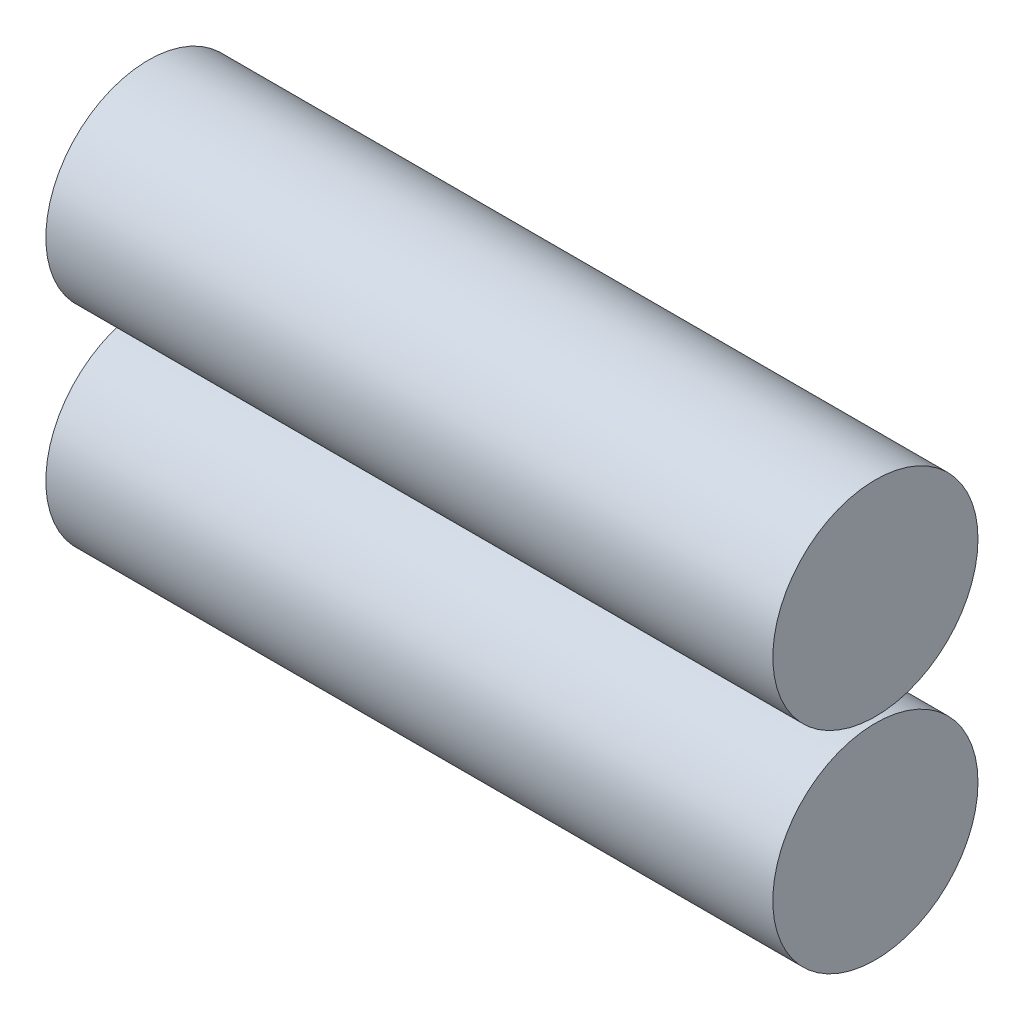
ISO-10303-21;
HEADER;
FILE_DESCRIPTION(('STEP AP214'),'2;1');
FILE_NAME('part.step','',(''),(''),'','','');
FILE_SCHEMA(('AUTOMOTIVE_DESIGN { 1 0 10303 214 1 1 1 1 }'));
ENDSEC;
DATA;
#1=APPLICATION_CONTEXT('core data for automotive mechanical design processes');
#2=APPLICATION_PROTOCOL_DEFINITION('international standard','automotive_design',2000,#1);
#3=PRODUCT_CONTEXT('',#1,'mechanical');
#4=PRODUCT('Part','Part','',(#3));
#5=PRODUCT_RELATED_PRODUCT_CATEGORY('part','',(#4));
#6=PRODUCT_DEFINITION_FORMATION('','',#4);
#7=PRODUCT_DEFINITION_CONTEXT('part definition',#1,'design');
#8=PRODUCT_DEFINITION('design','',#6,#7);
#9=PRODUCT_DEFINITION_SHAPE('','',#8);
#10=(LENGTH_UNIT() NAMED_UNIT(*) SI_UNIT(.MILLI.,.METRE.));
#11=(NAMED_UNIT(*) PLANE_ANGLE_UNIT() SI_UNIT($,.RADIAN.));
#12=(NAMED_UNIT(*) SI_UNIT($,.STERADIAN.) SOLID_ANGLE_UNIT());
#13=UNCERTAINTY_MEASURE_WITH_UNIT(LENGTH_MEASURE(1.E-05),#10,'distance_accuracy_value','');
#14=(GEOMETRIC_REPRESENTATION_CONTEXT(3) GLOBAL_UNCERTAINTY_ASSIGNED_CONTEXT((#13)) GLOBAL_UNIT_ASSIGNED_CONTEXT((#10,
#11,#12)) REPRESENTATION_CONTEXT('',''));
#15=CARTESIAN_POINT('',(0.,0.,0.));
#16=DIRECTION('',(0.,0.,1.));
#17=DIRECTION('',(1.,0.,0.));
#18=AXIS2_PLACEMENT_3D('',#15,#16,#17);
#19=CARTESIAN_POINT('',(32.6,-30.55,14.2));
#20=DIRECTION('',(-1.,0.,0.));
#21=DIRECTION('',(0.,0.,1.));
#22=AXIS2_PLACEMENT_3D('',#19,#20,#21);
#23=CYLINDRICAL_SURFACE('',#22,9.2);
#24=CARTESIAN_POINT('',(32.6,-30.55,14.2));
#25=DIRECTION('',(1.,0.,0.));
#26=DIRECTION('',(0.,0.,-1.));
#27=AXIS2_PLACEMENT_3D('',#24,#25,#26);
#28=CIRCLE('',#27,9.2);
#29=CARTESIAN_POINT('',(32.6,-30.55,5.));
#30=VERTEX_POINT('',#29);
#31=EDGE_CURVE('E11',#30,#30,#28,.T.);
#32=ORIENTED_EDGE('',*,*,#31,.F.);
#33=EDGE_LOOP('',(#32));
#34=FACE_BOUND('',#33,.T.);
#35=CARTESIAN_POINT('',(-32.6,-30.55,14.2));
#36=DIRECTION('',(1.,0.,0.));
#37=DIRECTION('',(0.,0.,-1.));
#38=AXIS2_PLACEMENT_3D('',#35,#36,#37);
#39=CIRCLE('',#38,9.2);
#40=CARTESIAN_POINT('',(-32.6,-30.55,5.));
#41=VERTEX_POINT('',#40);
#42=EDGE_CURVE('E48',#41,#41,#39,.T.);
#43=ORIENTED_EDGE('',*,*,#42,.T.);
#44=EDGE_LOOP('',(#43));
#45=FACE_BOUND('',#44,.T.);
#46=ADVANCED_FACE('F45',(#34,#45),#23,.T.);
#47=CARTESIAN_POINT('',(32.6,-30.55,14.2));
#48=DIRECTION('',(1.,0.,0.));
#49=DIRECTION('',(0.,0.,-1.));
#50=AXIS2_PLACEMENT_3D('',#47,#48,#49);
#51=PLANE('',#50);
#52=ORIENTED_EDGE('',*,*,#31,.T.);
#53=EDGE_LOOP('',(#52));
#54=FACE_BOUND('',#53,.T.);
#55=ADVANCED_FACE('F60',(#54),#51,.T.);
#56=CARTESIAN_POINT('',(-32.6,-30.55,14.2));
#57=DIRECTION('',(1.,0.,0.));
#58=DIRECTION('',(0.,0.,-1.));
#59=AXIS2_PLACEMENT_3D('',#56,#57,#58);
#60=PLANE('',#59);
#61=ORIENTED_EDGE('',*,*,#42,.F.);
#62=EDGE_LOOP('',(#61));
#63=FACE_BOUND('',#62,.T.);
#64=ADVANCED_FACE('F58',(#63),#60,.F.);
#65=CLOSED_SHELL('',(#46,#55,#64));
#66=MANIFOLD_SOLID_BREP('B2',#65);
#67=CARTESIAN_POINT('',(32.6,-49.45,14.2));
#68=DIRECTION('',(-1.,0.,0.));
#69=DIRECTION('',(0.,0.,1.));
#70=AXIS2_PLACEMENT_3D('',#67,#68,#69);
#71=CYLINDRICAL_SURFACE('',#70,9.2);
#72=CARTESIAN_POINT('',(32.6,-49.45,14.2));
#73=DIRECTION('',(1.,0.,0.));
#74=DIRECTION('',(0.,0.,-1.));
#75=AXIS2_PLACEMENT_3D('',#72,#73,#74);
#76=CIRCLE('',#75,9.2);
#77=CARTESIAN_POINT('',(32.6,-49.45,5.));
#78=VERTEX_POINT('',#77);
#79=EDGE_CURVE('E44',#78,#78,#76,.T.);
#80=ORIENTED_EDGE('',*,*,#79,.F.);
#81=EDGE_LOOP('',(#80));
#82=FACE_BOUND('',#81,.T.);
#83=CARTESIAN_POINT('',(-32.6,-49.45,14.2));
#84=DIRECTION('',(1.,0.,0.));
#85=DIRECTION('',(0.,0.,-1.));
#86=AXIS2_PLACEMENT_3D('',#83,#84,#85);
#87=CIRCLE('',#86,9.2);
#88=CARTESIAN_POINT('',(-32.6,-49.45,5.));
#89=VERTEX_POINT('',#88);
#90=EDGE_CURVE('E101',#89,#89,#87,.T.);
#91=ORIENTED_EDGE('',*,*,#90,.T.);
#92=EDGE_LOOP('',(#91));
#93=FACE_BOUND('',#92,.T.);
#94=ADVANCED_FACE('F98',(#82,#93),#71,.T.);
#95=CARTESIAN_POINT('',(32.6,-49.45,14.2));
#96=DIRECTION('',(1.,0.,0.));
#97=DIRECTION('',(0.,0.,-1.));
#98=AXIS2_PLACEMENT_3D('',#95,#96,#97);
#99=PLANE('',#98);
#100=ORIENTED_EDGE('',*,*,#79,.T.);
#101=EDGE_LOOP('',(#100));
#102=FACE_BOUND('',#101,.T.);
#103=ADVANCED_FACE('F113',(#102),#99,.T.);
#104=CARTESIAN_POINT('',(-32.6,-49.45,14.2));
#105=DIRECTION('',(1.,0.,0.));
#106=DIRECTION('',(0.,0.,-1.));
#107=AXIS2_PLACEMENT_3D('',#104,#105,#106);
#108=PLANE('',#107);
#109=ORIENTED_EDGE('',*,*,#90,.F.);
#110=EDGE_LOOP('',(#109));
#111=FACE_BOUND('',#110,.T.);
#112=ADVANCED_FACE('F111',(#111),#108,.F.);
#113=CLOSED_SHELL('',(#94,#103,#112));
#114=MANIFOLD_SOLID_BREP('B6',#113);
#115=ADVANCED_BREP_SHAPE_REPRESENTATION('',(#18,#66,#114),#14);
#116=SHAPE_DEFINITION_REPRESENTATION(#9,#115);
ENDSEC;
END-ISO-10303-21;
